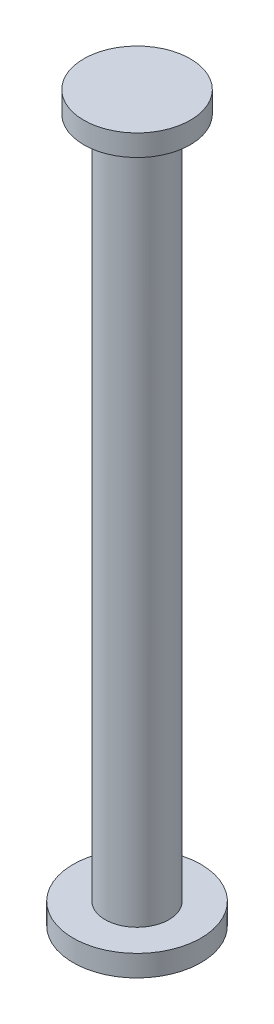
ISO-10303-21;
HEADER;
FILE_DESCRIPTION(('STEP AP214'),'2;1');
FILE_NAME('part.step','',(''),(''),'','','');
FILE_SCHEMA(('AUTOMOTIVE_DESIGN { 1 0 10303 214 1 1 1 1 }'));
ENDSEC;
DATA;
#1=APPLICATION_CONTEXT('core data for automotive mechanical design processes');
#2=APPLICATION_PROTOCOL_DEFINITION('international standard','automotive_design',2000,#1);
#3=PRODUCT_CONTEXT('',#1,'mechanical');
#4=PRODUCT('Part','Part','',(#3));
#5=PRODUCT_RELATED_PRODUCT_CATEGORY('part','',(#4));
#6=PRODUCT_DEFINITION_FORMATION('','',#4);
#7=PRODUCT_DEFINITION_CONTEXT('part definition',#1,'design');
#8=PRODUCT_DEFINITION('design','',#6,#7);
#9=PRODUCT_DEFINITION_SHAPE('','',#8);
#10=(LENGTH_UNIT() NAMED_UNIT(*) SI_UNIT(.MILLI.,.METRE.));
#11=(NAMED_UNIT(*) PLANE_ANGLE_UNIT() SI_UNIT($,.RADIAN.));
#12=(NAMED_UNIT(*) SI_UNIT($,.STERADIAN.) SOLID_ANGLE_UNIT());
#13=UNCERTAINTY_MEASURE_WITH_UNIT(LENGTH_MEASURE(1.E-05),#10,'distance_accuracy_value','');
#14=(GEOMETRIC_REPRESENTATION_CONTEXT(3) GLOBAL_UNCERTAINTY_ASSIGNED_CONTEXT((#13)) GLOBAL_UNIT_ASSIGNED_CONTEXT((#10,
#11,#12)) REPRESENTATION_CONTEXT('',''));
#15=CARTESIAN_POINT('',(0.,0.,0.));
#16=DIRECTION('',(0.,0.,1.));
#17=DIRECTION('',(1.,0.,0.));
#18=AXIS2_PLACEMENT_3D('',#15,#16,#17);
#19=CARTESIAN_POINT('',(0.,1600.,0.));
#20=DIRECTION('',(0.,-1.,0.));
#21=DIRECTION('',(0.,0.,-1.));
#22=AXIS2_PLACEMENT_3D('',#19,#20,#21);
#23=CYLINDRICAL_SURFACE('',#22,75.);
#24=CARTESIAN_POINT('',(0.,1600.,0.));
#25=DIRECTION('',(0.,1.,0.));
#26=DIRECTION('',(0.,0.,1.));
#27=AXIS2_PLACEMENT_3D('',#24,#25,#26);
#28=CIRCLE('',#27,75.);
#29=CARTESIAN_POINT('',(0.,1600.,75.));
#30=VERTEX_POINT('',#29);
#31=EDGE_CURVE('E11',#30,#30,#28,.T.);
#32=ORIENTED_EDGE('',*,*,#31,.F.);
#33=EDGE_LOOP('',(#32));
#34=FACE_BOUND('',#33,.T.);
#35=CARTESIAN_POINT('',(0.,0.,0.));
#36=DIRECTION('',(0.,-1.,0.));
#37=DIRECTION('',(0.,0.,-1.));
#38=AXIS2_PLACEMENT_3D('',#35,#36,#37);
#39=CIRCLE('',#38,75.);
#40=CARTESIAN_POINT('',(0.,0.,-75.));
#41=VERTEX_POINT('',#40);
#42=EDGE_CURVE('E168',#41,#41,#39,.T.);
#43=ORIENTED_EDGE('',*,*,#42,.F.);
#44=EDGE_LOOP('',(#43));
#45=FACE_BOUND('',#44,.T.);
#46=ADVANCED_FACE('F32',(#34,#45),#23,.T.);
#47=CARTESIAN_POINT('',(0.,1650.,0.));
#48=DIRECTION('',(0.,-1.,0.));
#49=DIRECTION('',(0.,0.,-1.));
#50=AXIS2_PLACEMENT_3D('',#47,#48,#49);
#51=CYLINDRICAL_SURFACE('',#50,125.);
#52=CARTESIAN_POINT('',(0.,1650.,0.));
#53=DIRECTION('',(0.,1.,0.));
#54=DIRECTION('',(0.,0.,1.));
#55=AXIS2_PLACEMENT_3D('',#52,#53,#54);
#56=CIRCLE('',#55,125.);
#57=CARTESIAN_POINT('',(0.,1650.,125.));
#58=VERTEX_POINT('',#57);
#59=EDGE_CURVE('E39',#58,#58,#56,.T.);
#60=ORIENTED_EDGE('',*,*,#59,.F.);
#61=EDGE_LOOP('',(#60));
#62=FACE_BOUND('',#61,.T.);
#63=CARTESIAN_POINT('',(0.,1600.,0.));
#64=DIRECTION('',(0.,1.,0.));
#65=DIRECTION('',(0.,0.,1.));
#66=AXIS2_PLACEMENT_3D('',#63,#64,#65);
#67=CIRCLE('',#66,125.);
#68=CARTESIAN_POINT('',(0.,1600.,125.));
#69=VERTEX_POINT('',#68);
#70=EDGE_CURVE('E173',#69,#69,#67,.T.);
#71=ORIENTED_EDGE('',*,*,#70,.T.);
#72=EDGE_LOOP('',(#71));
#73=FACE_BOUND('',#72,.T.);
#74=ADVANCED_FACE('F178',(#62,#73),#51,.T.);
#75=CARTESIAN_POINT('',(0.,1650.,0.));
#76=DIRECTION('',(0.,1.,0.));
#77=DIRECTION('',(0.,0.,1.));
#78=AXIS2_PLACEMENT_3D('',#75,#76,#77);
#79=PLANE('',#78);
#80=ORIENTED_EDGE('',*,*,#59,.T.);
#81=EDGE_LOOP('',(#80));
#82=FACE_BOUND('',#81,.T.);
#83=ADVANCED_FACE('F183',(#82),#79,.T.);
#84=CARTESIAN_POINT('',(0.,1600.,0.));
#85=DIRECTION('',(0.,1.,0.));
#86=DIRECTION('',(0.,0.,1.));
#87=AXIS2_PLACEMENT_3D('',#84,#85,#86);
#88=PLANE('',#87);
#89=ORIENTED_EDGE('',*,*,#31,.T.);
#90=EDGE_LOOP('',(#89));
#91=FACE_BOUND('',#90,.T.);
#92=ORIENTED_EDGE('',*,*,#70,.F.);
#93=EDGE_LOOP('',(#92));
#94=FACE_BOUND('',#93,.T.);
#95=ADVANCED_FACE('F180',(#91,#94),#88,.F.);
#96=CARTESIAN_POINT('',(0.,-50.,0.));
#97=DIRECTION('',(0.,1.,0.));
#98=DIRECTION('',(0.,0.,1.));
#99=AXIS2_PLACEMENT_3D('',#96,#97,#98);
#100=CYLINDRICAL_SURFACE('',#99,150.);
#101=CARTESIAN_POINT('',(0.,-50.,0.));
#102=DIRECTION('',(0.,-1.,0.));
#103=DIRECTION('',(0.,0.,-1.));
#104=AXIS2_PLACEMENT_3D('',#101,#102,#103);
#105=CIRCLE('',#104,150.);
#106=CARTESIAN_POINT('',(0.,-50.,-150.));
#107=VERTEX_POINT('',#106);
#108=EDGE_CURVE('E165',#107,#107,#105,.T.);
#109=ORIENTED_EDGE('',*,*,#108,.F.);
#110=EDGE_LOOP('',(#109));
#111=FACE_BOUND('',#110,.T.);
#112=CARTESIAN_POINT('',(0.,0.,0.));
#113=DIRECTION('',(0.,-1.,0.));
#114=DIRECTION('',(0.,0.,-1.));
#115=AXIS2_PLACEMENT_3D('',#112,#113,#114);
#116=CIRCLE('',#115,150.);
#117=CARTESIAN_POINT('',(0.,0.,-150.));
#118=VERTEX_POINT('',#117);
#119=EDGE_CURVE('E159',#118,#118,#116,.T.);
#120=ORIENTED_EDGE('',*,*,#119,.T.);
#121=EDGE_LOOP('',(#120));
#122=FACE_BOUND('',#121,.T.);
#123=ADVANCED_FACE('F182',(#111,#122),#100,.T.);
#124=CARTESIAN_POINT('',(0.,-50.,0.));
#125=DIRECTION('',(0.,-1.,0.));
#126=DIRECTION('',(0.,0.,-1.));
#127=AXIS2_PLACEMENT_3D('',#124,#125,#126);
#128=PLANE('',#127);
#129=DIRECTION('',(-1.,0.,0.));
#130=VECTOR('',#129,1.);
#131=CARTESIAN_POINT('',(100.,-50.,5.00000000000002));
#132=LINE('',#131,#130);
#133=CARTESIAN_POINT('',(100.,-50.,5.00000000000002));
#134=VERTEX_POINT('',#133);
#135=CARTESIAN_POINT('',(30.,-50.,5.00000000000001));
#136=VERTEX_POINT('',#135);
#137=EDGE_CURVE('E46',#134,#136,#132,.T.);
#138=ORIENTED_EDGE('',*,*,#137,.F.);
#139=DIRECTION('',(0.,0.,1.));
#140=VECTOR('',#139,1.);
#141=CARTESIAN_POINT('',(100.,-50.,5.00000000000002));
#142=LINE('',#141,#140);
#143=CARTESIAN_POINT('',(100.,-50.,-15.));
#144=VERTEX_POINT('',#143);
#145=EDGE_CURVE('E116',#144,#134,#142,.T.);
#146=ORIENTED_EDGE('',*,*,#145,.F.);
#147=DIRECTION('',(1.,0.,0.));
#148=VECTOR('',#147,1.);
#149=CARTESIAN_POINT('',(100.,-50.,-15.));
#150=LINE('',#149,#148);
#151=CARTESIAN_POINT('',(30.,-50.,-15.));
#152=VERTEX_POINT('',#151);
#153=EDGE_CURVE('E119',#152,#144,#150,.T.);
#154=ORIENTED_EDGE('',*,*,#153,.F.);
#155=DIRECTION('',(0.,0.,-1.));
#156=VECTOR('',#155,1.);
#157=CARTESIAN_POINT('',(30.,-50.,5.00000000000001));
#158=LINE('',#157,#156);
#159=EDGE_CURVE('E125',#136,#152,#158,.T.);
#160=ORIENTED_EDGE('',*,*,#159,.F.);
#161=EDGE_LOOP('',(#138,#146,#154,#160));
#162=FACE_BOUND('',#161,.T.);
#163=DIRECTION('',(0.,0.,-1.));
#164=VECTOR('',#163,1.);
#165=CARTESIAN_POINT('',(-100.,-50.,5.));
#166=LINE('',#165,#164);
#167=CARTESIAN_POINT('',(-100.,-50.,5.));
#168=VERTEX_POINT('',#167);
#169=CARTESIAN_POINT('',(-100.,-50.,-15.));
#170=VERTEX_POINT('',#169);
#171=EDGE_CURVE('E54',#168,#170,#166,.T.);
#172=ORIENTED_EDGE('',*,*,#171,.F.);
#173=DIRECTION('',(-1.,0.,0.));
#174=VECTOR('',#173,1.);
#175=CARTESIAN_POINT('',(-100.,-50.,5.));
#176=LINE('',#175,#174);
#177=CARTESIAN_POINT('',(-30.,-50.,5.));
#178=VERTEX_POINT('',#177);
#179=EDGE_CURVE('E138',#178,#168,#176,.T.);
#180=ORIENTED_EDGE('',*,*,#179,.F.);
#181=DIRECTION('',(0.,0.,1.));
#182=VECTOR('',#181,1.);
#183=CARTESIAN_POINT('',(-30.,-50.,5.));
#184=LINE('',#183,#182);
#185=CARTESIAN_POINT('',(-30.,-50.,-15.));
#186=VERTEX_POINT('',#185);
#187=EDGE_CURVE('E152',#186,#178,#184,.T.);
#188=ORIENTED_EDGE('',*,*,#187,.F.);
#189=DIRECTION('',(1.,0.,0.));
#190=VECTOR('',#189,1.);
#191=CARTESIAN_POINT('',(-100.,-50.,-15.));
#192=LINE('',#191,#190);
#193=EDGE_CURVE('E149',#170,#186,#192,.T.);
#194=ORIENTED_EDGE('',*,*,#193,.F.);
#195=EDGE_LOOP('',(#172,#180,#188,#194));
#196=FACE_BOUND('',#195,.T.);
#197=ORIENTED_EDGE('',*,*,#108,.T.);
#198=EDGE_LOOP('',(#197));
#199=FACE_BOUND('',#198,.T.);
#200=ADVANCED_FACE('F190',(#162,#196,#199),#128,.T.);
#201=CARTESIAN_POINT('',(0.,0.,0.));
#202=DIRECTION('',(0.,-1.,0.));
#203=DIRECTION('',(0.,0.,-1.));
#204=AXIS2_PLACEMENT_3D('',#201,#202,#203);
#205=PLANE('',#204);
#206=ORIENTED_EDGE('',*,*,#42,.T.);
#207=EDGE_LOOP('',(#206));
#208=FACE_BOUND('',#207,.T.);
#209=ORIENTED_EDGE('',*,*,#119,.F.);
#210=EDGE_LOOP('',(#209));
#211=FACE_BOUND('',#210,.T.);
#212=ADVANCED_FACE('F205',(#208,#211),#205,.F.);
#213=CARTESIAN_POINT('',(-100.,-20.,5.));
#214=DIRECTION('',(-1.,0.,0.));
#215=DIRECTION('',(0.,0.,1.));
#216=AXIS2_PLACEMENT_3D('',#213,#214,#215);
#217=PLANE('',#216);
#218=ORIENTED_EDGE('',*,*,#171,.T.);
#219=DIRECTION('',(0.,-1.,0.));
#220=VECTOR('',#219,1.);
#221=CARTESIAN_POINT('',(-100.,-20.,-15.));
#222=LINE('',#221,#220);
#223=CARTESIAN_POINT('',(-100.,-20.,-15.));
#224=VERTEX_POINT('',#223);
#225=EDGE_CURVE('E147',#224,#170,#222,.T.);
#226=ORIENTED_EDGE('',*,*,#225,.F.);
#227=DIRECTION('',(0.,0.,-1.));
#228=VECTOR('',#227,1.);
#229=CARTESIAN_POINT('',(-100.,-20.,5.));
#230=LINE('',#229,#228);
#231=CARTESIAN_POINT('',(-100.,-20.,5.));
#232=VERTEX_POINT('',#231);
#233=EDGE_CURVE('E134',#232,#224,#230,.T.);
#234=ORIENTED_EDGE('',*,*,#233,.F.);
#235=DIRECTION('',(0.,-1.,0.));
#236=VECTOR('',#235,1.);
#237=CARTESIAN_POINT('',(-100.,-20.,5.));
#238=LINE('',#237,#236);
#239=EDGE_CURVE('E157',#232,#168,#238,.T.);
#240=ORIENTED_EDGE('',*,*,#239,.T.);
#241=EDGE_LOOP('',(#218,#226,#234,#240));
#242=FACE_BOUND('',#241,.T.);
#243=ADVANCED_FACE('F208',(#242),#217,.F.);
#244=CARTESIAN_POINT('',(-100.,-20.,5.));
#245=DIRECTION('',(0.,0.,1.));
#246=DIRECTION('',(1.,0.,0.));
#247=AXIS2_PLACEMENT_3D('',#244,#245,#246);
#248=PLANE('',#247);
#249=ORIENTED_EDGE('',*,*,#179,.T.);
#250=ORIENTED_EDGE('',*,*,#239,.F.);
#251=DIRECTION('',(-1.,0.,0.));
#252=VECTOR('',#251,1.);
#253=CARTESIAN_POINT('',(-100.,-20.,5.));
#254=LINE('',#253,#252);
#255=CARTESIAN_POINT('',(-30.,-20.,5.));
#256=VERTEX_POINT('',#255);
#257=EDGE_CURVE('E144',#256,#232,#254,.T.);
#258=ORIENTED_EDGE('',*,*,#257,.F.);
#259=DIRECTION('',(0.,-1.,0.));
#260=VECTOR('',#259,1.);
#261=CARTESIAN_POINT('',(-30.,-20.,5.));
#262=LINE('',#261,#260);
#263=EDGE_CURVE('E160',#256,#178,#262,.T.);
#264=ORIENTED_EDGE('',*,*,#263,.T.);
#265=EDGE_LOOP('',(#249,#250,#258,#264));
#266=FACE_BOUND('',#265,.T.);
#267=ADVANCED_FACE('F216',(#266),#248,.F.);
#268=CARTESIAN_POINT('',(-30.,-20.,5.));
#269=DIRECTION('',(1.,0.,0.));
#270=DIRECTION('',(0.,0.,-1.));
#271=AXIS2_PLACEMENT_3D('',#268,#269,#270);
#272=PLANE('',#271);
#273=ORIENTED_EDGE('',*,*,#187,.T.);
#274=ORIENTED_EDGE('',*,*,#263,.F.);
#275=DIRECTION('',(0.,0.,1.));
#276=VECTOR('',#275,1.);
#277=CARTESIAN_POINT('',(-30.,-20.,5.));
#278=LINE('',#277,#276);
#279=CARTESIAN_POINT('',(-30.,-20.,-15.));
#280=VERTEX_POINT('',#279);
#281=EDGE_CURVE('E141',#280,#256,#278,.T.);
#282=ORIENTED_EDGE('',*,*,#281,.F.);
#283=DIRECTION('',(0.,-1.,0.));
#284=VECTOR('',#283,1.);
#285=CARTESIAN_POINT('',(-30.,-20.,-15.));
#286=LINE('',#285,#284);
#287=EDGE_CURVE('E162',#280,#186,#286,.T.);
#288=ORIENTED_EDGE('',*,*,#287,.T.);
#289=EDGE_LOOP('',(#273,#274,#282,#288));
#290=FACE_BOUND('',#289,.T.);
#291=ADVANCED_FACE('F226',(#290),#272,.F.);
#292=CARTESIAN_POINT('',(-100.,-20.,-15.));
#293=DIRECTION('',(0.,0.,-1.));
#294=DIRECTION('',(-1.,0.,0.));
#295=AXIS2_PLACEMENT_3D('',#292,#293,#294);
#296=PLANE('',#295);
#297=ORIENTED_EDGE('',*,*,#193,.T.);
#298=ORIENTED_EDGE('',*,*,#287,.F.);
#299=DIRECTION('',(1.,0.,0.));
#300=VECTOR('',#299,1.);
#301=CARTESIAN_POINT('',(-100.,-20.,-15.));
#302=LINE('',#301,#300);
#303=EDGE_CURVE('E137',#224,#280,#302,.T.);
#304=ORIENTED_EDGE('',*,*,#303,.F.);
#305=ORIENTED_EDGE('',*,*,#225,.T.);
#306=EDGE_LOOP('',(#297,#298,#304,#305));
#307=FACE_BOUND('',#306,.T.);
#308=ADVANCED_FACE('F222',(#307),#296,.F.);
#309=CARTESIAN_POINT('',(0.,-20.,0.));
#310=DIRECTION('',(0.,-1.,0.));
#311=DIRECTION('',(0.,0.,-1.));
#312=AXIS2_PLACEMENT_3D('',#309,#310,#311);
#313=PLANE('',#312);
#314=ORIENTED_EDGE('',*,*,#233,.T.);
#315=ORIENTED_EDGE('',*,*,#303,.T.);
#316=ORIENTED_EDGE('',*,*,#281,.T.);
#317=ORIENTED_EDGE('',*,*,#257,.T.);
#318=EDGE_LOOP('',(#314,#315,#316,#317));
#319=FACE_BOUND('',#318,.T.);
#320=ADVANCED_FACE('F225',(#319),#313,.T.);
#321=CARTESIAN_POINT('',(100.,-20.,5.00000000000002));
#322=DIRECTION('',(0.,0.,1.));
#323=DIRECTION('',(1.,0.,0.));
#324=AXIS2_PLACEMENT_3D('',#321,#322,#323);
#325=PLANE('',#324);
#326=ORIENTED_EDGE('',*,*,#137,.T.);
#327=DIRECTION('',(0.,-1.,0.));
#328=VECTOR('',#327,1.);
#329=CARTESIAN_POINT('',(30.,-20.,5.00000000000001));
#330=LINE('',#329,#328);
#331=CARTESIAN_POINT('',(30.,-20.,5.00000000000001));
#332=VERTEX_POINT('',#331);
#333=EDGE_CURVE('E94',#332,#136,#330,.T.);
#334=ORIENTED_EDGE('',*,*,#333,.F.);
#335=DIRECTION('',(-1.,0.,0.));
#336=VECTOR('',#335,1.);
#337=CARTESIAN_POINT('',(100.,-20.,5.00000000000002));
#338=LINE('',#337,#336);
#339=CARTESIAN_POINT('',(100.,-20.,5.00000000000002));
#340=VERTEX_POINT('',#339);
#341=EDGE_CURVE('E98',#340,#332,#338,.T.);
#342=ORIENTED_EDGE('',*,*,#341,.F.);
#343=DIRECTION('',(0.,-1.,0.));
#344=VECTOR('',#343,1.);
#345=CARTESIAN_POINT('',(100.,-20.,5.00000000000002));
#346=LINE('',#345,#344);
#347=EDGE_CURVE('E129',#340,#134,#346,.T.);
#348=ORIENTED_EDGE('',*,*,#347,.T.);
#349=EDGE_LOOP('',(#326,#334,#342,#348));
#350=FACE_BOUND('',#349,.T.);
#351=ADVANCED_FACE('F96',(#350),#325,.F.);
#352=CARTESIAN_POINT('',(100.,-20.,5.00000000000002));
#353=DIRECTION('',(1.,0.,0.));
#354=DIRECTION('',(0.,0.,-1.));
#355=AXIS2_PLACEMENT_3D('',#352,#353,#354);
#356=PLANE('',#355);
#357=ORIENTED_EDGE('',*,*,#145,.T.);
#358=ORIENTED_EDGE('',*,*,#347,.F.);
#359=DIRECTION('',(0.,0.,1.));
#360=VECTOR('',#359,1.);
#361=CARTESIAN_POINT('',(100.,-20.,5.00000000000002));
#362=LINE('',#361,#360);
#363=CARTESIAN_POINT('',(100.,-20.,-15.));
#364=VERTEX_POINT('',#363);
#365=EDGE_CURVE('E104',#364,#340,#362,.T.);
#366=ORIENTED_EDGE('',*,*,#365,.F.);
#367=DIRECTION('',(0.,-1.,0.));
#368=VECTOR('',#367,1.);
#369=CARTESIAN_POINT('',(100.,-20.,-15.));
#370=LINE('',#369,#368);
#371=EDGE_CURVE('E131',#364,#144,#370,.T.);
#372=ORIENTED_EDGE('',*,*,#371,.T.);
#373=EDGE_LOOP('',(#357,#358,#366,#372));
#374=FACE_BOUND('',#373,.T.);
#375=ADVANCED_FACE('F239',(#374),#356,.F.);
#376=CARTESIAN_POINT('',(100.,-20.,-15.));
#377=DIRECTION('',(0.,0.,-1.));
#378=DIRECTION('',(-1.,0.,0.));
#379=AXIS2_PLACEMENT_3D('',#376,#377,#378);
#380=PLANE('',#379);
#381=ORIENTED_EDGE('',*,*,#153,.T.);
#382=ORIENTED_EDGE('',*,*,#371,.F.);
#383=DIRECTION('',(1.,0.,0.));
#384=VECTOR('',#383,1.);
#385=CARTESIAN_POINT('',(100.,-20.,-15.));
#386=LINE('',#385,#384);
#387=CARTESIAN_POINT('',(30.,-20.,-15.));
#388=VERTEX_POINT('',#387);
#389=EDGE_CURVE('E112',#388,#364,#386,.T.);
#390=ORIENTED_EDGE('',*,*,#389,.F.);
#391=DIRECTION('',(0.,-1.,0.));
#392=VECTOR('',#391,1.);
#393=CARTESIAN_POINT('',(30.,-20.,-15.));
#394=LINE('',#393,#392);
#395=EDGE_CURVE('E103',#388,#152,#394,.T.);
#396=ORIENTED_EDGE('',*,*,#395,.T.);
#397=EDGE_LOOP('',(#381,#382,#390,#396));
#398=FACE_BOUND('',#397,.T.);
#399=ADVANCED_FACE('F242',(#398),#380,.F.);
#400=CARTESIAN_POINT('',(30.,-20.,5.00000000000001));
#401=DIRECTION('',(-1.,0.,0.));
#402=DIRECTION('',(0.,0.,1.));
#403=AXIS2_PLACEMENT_3D('',#400,#401,#402);
#404=PLANE('',#403);
#405=ORIENTED_EDGE('',*,*,#159,.T.);
#406=ORIENTED_EDGE('',*,*,#395,.F.);
#407=DIRECTION('',(0.,0.,-1.));
#408=VECTOR('',#407,1.);
#409=CARTESIAN_POINT('',(30.,-20.,5.00000000000001));
#410=LINE('',#409,#408);
#411=EDGE_CURVE('E107',#332,#388,#410,.T.);
#412=ORIENTED_EDGE('',*,*,#411,.F.);
#413=ORIENTED_EDGE('',*,*,#333,.T.);
#414=EDGE_LOOP('',(#405,#406,#412,#413));
#415=FACE_BOUND('',#414,.T.);
#416=ADVANCED_FACE('F108',(#415),#404,.F.);
#417=CARTESIAN_POINT('',(0.,-20.,0.));
#418=DIRECTION('',(0.,-1.,0.));
#419=DIRECTION('',(0.,0.,-1.));
#420=AXIS2_PLACEMENT_3D('',#417,#418,#419);
#421=PLANE('',#420);
#422=ORIENTED_EDGE('',*,*,#341,.T.);
#423=ORIENTED_EDGE('',*,*,#411,.T.);
#424=ORIENTED_EDGE('',*,*,#389,.T.);
#425=ORIENTED_EDGE('',*,*,#365,.T.);
#426=EDGE_LOOP('',(#422,#423,#424,#425));
#427=FACE_BOUND('',#426,.T.);
#428=ADVANCED_FACE('F114',(#427),#421,.T.);
#429=CLOSED_SHELL('',(#46,#74,#83,#95,#123,#200,#212,#243,#267,#291,#308,#320,#351,#375,#399,
#416,#428));
#430=MANIFOLD_SOLID_BREP('B2',#429);
#431=ADVANCED_BREP_SHAPE_REPRESENTATION('',(#18,#430),#14);
#432=SHAPE_DEFINITION_REPRESENTATION(#9,#431);
ENDSEC;
END-ISO-10303-21;
